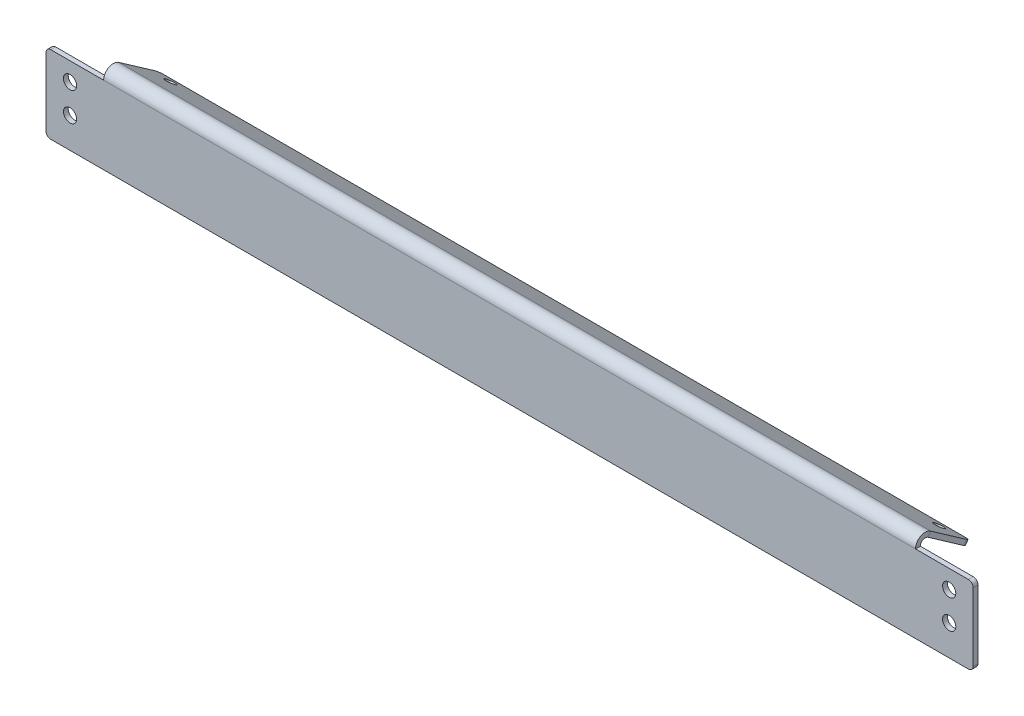
ISO-10303-21;
HEADER;
FILE_DESCRIPTION(('STEP AP214'),'2;1');
FILE_NAME('part.step','',(''),(''),'','','');
FILE_SCHEMA(('AUTOMOTIVE_DESIGN { 1 0 10303 214 1 1 1 1 }'));
ENDSEC;
DATA;
#1=APPLICATION_CONTEXT('core data for automotive mechanical design processes');
#2=APPLICATION_PROTOCOL_DEFINITION('international standard','automotive_design',2000,#1);
#3=PRODUCT_CONTEXT('',#1,'mechanical');
#4=PRODUCT('Part','Part','',(#3));
#5=PRODUCT_RELATED_PRODUCT_CATEGORY('part','',(#4));
#6=PRODUCT_DEFINITION_FORMATION('','',#4);
#7=PRODUCT_DEFINITION_CONTEXT('part definition',#1,'design');
#8=PRODUCT_DEFINITION('design','',#6,#7);
#9=PRODUCT_DEFINITION_SHAPE('','',#8);
#10=(LENGTH_UNIT() NAMED_UNIT(*) SI_UNIT(.MILLI.,.METRE.));
#11=(NAMED_UNIT(*) PLANE_ANGLE_UNIT() SI_UNIT($,.RADIAN.));
#12=(NAMED_UNIT(*) SI_UNIT($,.STERADIAN.) SOLID_ANGLE_UNIT());
#13=UNCERTAINTY_MEASURE_WITH_UNIT(LENGTH_MEASURE(1.E-05),#10,'distance_accuracy_value','');
#14=(GEOMETRIC_REPRESENTATION_CONTEXT(3) GLOBAL_UNCERTAINTY_ASSIGNED_CONTEXT((#13)) GLOBAL_UNIT_ASSIGNED_CONTEXT((#10,
#11,#12)) REPRESENTATION_CONTEXT('',''));
#15=CARTESIAN_POINT('',(0.,0.,0.));
#16=DIRECTION('',(0.,0.,1.));
#17=DIRECTION('',(1.,0.,0.));
#18=AXIS2_PLACEMENT_3D('',#15,#16,#17);
#19=CARTESIAN_POINT('',(612.775,60.8991922593825,1.82110518541458));
#20=DIRECTION('',(0.,0.819152044288989,-0.57357643635105));
#21=DIRECTION('',(0.,0.57357643635105,0.819152044288989));
#22=AXIS2_PLACEMENT_3D('',#19,#20,#21);
#23=PLANE('',#22);
#24=CARTESIAN_POINT('',(560.3875,39.9564826271147,-28.0881838316871));
#25=DIRECTION('',(0.,0.819152044288989,-0.57357643635105));
#26=DIRECTION('',(0.,0.57357643635105,0.819152044288989));
#27=AXIS2_PLACEMENT_3D('',#24,#25,#26);
#28=CIRCLE('',#27,3.429);
#29=CARTESIAN_POINT('',(560.3875,41.9232762273625,-25.2793114718202));
#30=VERTEX_POINT('',#29);
#31=EDGE_CURVE('E544',#30,#30,#28,.T.);
#32=ORIENTED_EDGE('',*,*,#31,.T.);
#33=EDGE_LOOP('',(#32));
#34=FACE_BOUND('',#33,.T.);
#35=CARTESIAN_POINT('',(52.3874999999999,39.9564826271147,-28.0881838316871));
#36=DIRECTION('',(0.,0.819152044288989,-0.57357643635105));
#37=DIRECTION('',(0.,0.57357643635105,0.819152044288989));
#38=AXIS2_PLACEMENT_3D('',#35,#36,#37);
#39=CIRCLE('',#38,3.429);
#40=CARTESIAN_POINT('',(52.3874999999999,41.9232762273625,-25.2793114718202));
#41=VERTEX_POINT('',#40);
#42=EDGE_CURVE('E567',#41,#41,#39,.T.);
#43=ORIENTED_EDGE('',*,*,#42,.T.);
#44=EDGE_LOOP('',(#43));
#45=FACE_BOUND('',#44,.T.);
#46=DIRECTION('',(-1.,0.,0.));
#47=VECTOR('',#46,1.);
#48=CARTESIAN_POINT('',(612.775,35.4037196635783,-34.590203183231));
#49=LINE('',#48,#47);
#50=CARTESIAN_POINT('',(571.5,35.4037196635783,-34.590203183231));
#51=VERTEX_POINT('',#50);
#52=CARTESIAN_POINT('',(41.2750000000001,35.4037196635783,-34.590203183231));
#53=VERTEX_POINT('',#52);
#54=EDGE_CURVE('E384',#51,#53,#49,.T.);
#55=ORIENTED_EDGE('',*,*,#54,.F.);
#56=CARTESIAN_POINT('',(571.5,37.2248248489929,-31.9893954426134));
#57=DIRECTION('',(0.,0.819152044288989,-0.57357643635105));
#58=DIRECTION('',(0.,0.57357643635105,0.819152044288989));
#59=AXIS2_PLACEMENT_3D('',#56,#57,#58);
#60=CIRCLE('',#59,3.175);
#61=CARTESIAN_POINT('',(574.675,37.2248248489929,-31.9893954426134));
#62=VERTEX_POINT('',#61);
#63=EDGE_CURVE('E315',#51,#62,#60,.F.);
#64=ORIENTED_EDGE('',*,*,#63,.T.);
#65=DIRECTION('',(0.,0.57357643635105,0.819152044288989));
#66=VECTOR('',#65,1.);
#67=CARTESIAN_POINT('',(574.675,60.8991922593825,1.82110518541458));
#68=LINE('',#67,#66);
#69=CARTESIAN_POINT('',(574.675,53.9025712343506,-8.17110518541458));
#70=VERTEX_POINT('',#69);
#71=EDGE_CURVE('E309',#62,#70,#68,.T.);
#72=ORIENTED_EDGE('',*,*,#71,.T.);
#73=DIRECTION('',(-1.,0.,0.));
#74=VECTOR('',#73,1.);
#75=CARTESIAN_POINT('',(612.775,53.9025712343506,-8.17110518541458));
#76=LINE('',#75,#74);
#77=CARTESIAN_POINT('',(38.1,53.9025712343506,-8.17110518541458));
#78=VERTEX_POINT('',#77);
#79=EDGE_CURVE('E314',#70,#78,#76,.T.);
#80=ORIENTED_EDGE('',*,*,#79,.T.);
#81=DIRECTION('',(0.,-0.57357643635105,-0.819152044288989));
#82=VECTOR('',#81,1.);
#83=CARTESIAN_POINT('',(38.1,44.6531454489644,-21.3806541843228));
#84=LINE('',#83,#82);
#85=CARTESIAN_POINT('',(38.1,37.2248248489929,-31.9893954426134));
#86=VERTEX_POINT('',#85);
#87=EDGE_CURVE('E525',#86,#78,#84,.F.);
#88=ORIENTED_EDGE('',*,*,#87,.F.);
#89=CARTESIAN_POINT('',(41.2750000000001,37.2248248489929,-31.9893954426134));
#90=DIRECTION('',(0.,0.819152044288989,-0.57357643635105));
#91=DIRECTION('',(0.,0.57357643635105,0.819152044288989));
#92=AXIS2_PLACEMENT_3D('',#89,#90,#91);
#93=CIRCLE('',#92,3.175);
#94=EDGE_CURVE('E396',#86,#53,#93,.F.);
#95=ORIENTED_EDGE('',*,*,#94,.T.);
#96=EDGE_LOOP('',(#55,#64,#72,#80,#88,#95));
#97=FACE_BOUND('',#96,.T.);
#98=ADVANCED_FACE('F196',(#34,#45,#97),#23,.F.);
#99=CARTESIAN_POINT('',(612.775,38.0045274041958,-36.4113083686456));
#100=DIRECTION('',(0.,-0.57357643635105,-0.819152044288989));
#101=DIRECTION('',(0.,0.819152044288989,-0.57357643635105));
#102=AXIS2_PLACEMENT_3D('',#99,#100,#101);
#103=PLANE('',#102);
#104=DIRECTION('',(-1.,0.,0.));
#105=VECTOR('',#104,1.);
#106=CARTESIAN_POINT('',(612.775,38.0045274041958,-36.4113083686456));
#107=LINE('',#106,#105);
#108=CARTESIAN_POINT('',(571.5,38.0045274041958,-36.4113083686456));
#109=VERTEX_POINT('',#108);
#110=CARTESIAN_POINT('',(41.2750000000001,38.0045274041958,-36.4113083686456));
#111=VERTEX_POINT('',#110);
#112=EDGE_CURVE('E380',#109,#111,#107,.T.);
#113=ORIENTED_EDGE('',*,*,#112,.F.);
#114=DIRECTION('',(0.,0.819152044288989,-0.57357643635105));
#115=VECTOR('',#114,1.);
#116=CARTESIAN_POINT('',(571.5,38.0045274041958,-36.4113083686456));
#117=LINE('',#116,#115);
#118=EDGE_CURVE('E392',#109,#51,#117,.F.);
#119=ORIENTED_EDGE('',*,*,#118,.T.);
#120=ORIENTED_EDGE('',*,*,#54,.T.);
#121=DIRECTION('',(0.,-0.819152044288989,0.57357643635105));
#122=VECTOR('',#121,1.);
#123=CARTESIAN_POINT('',(41.2750000000001,38.0045274041958,-36.4113083686455));
#124=LINE('',#123,#122);
#125=EDGE_CURVE('E388',#53,#111,#124,.F.);
#126=ORIENTED_EDGE('',*,*,#125,.T.);
#127=EDGE_LOOP('',(#113,#119,#120,#126));
#128=FACE_BOUND('',#127,.T.);
#129=ADVANCED_FACE('F594',(#128),#103,.T.);
#130=CARTESIAN_POINT('',(612.775,63.5,0.));
#131=DIRECTION('',(0.,0.819152044288989,-0.57357643635105));
#132=DIRECTION('',(0.,0.57357643635105,0.819152044288989));
#133=AXIS2_PLACEMENT_3D('',#130,#131,#132);
#134=PLANE('',#133);
#135=CARTESIAN_POINT('',(560.3875,42.5572903677323,-29.9092890171017));
#136=DIRECTION('',(0.,0.819152044288989,-0.57357643635105));
#137=DIRECTION('',(0.,0.57357643635105,0.819152044288989));
#138=AXIS2_PLACEMENT_3D('',#135,#136,#137);
#139=CIRCLE('',#138,3.429);
#140=CARTESIAN_POINT('',(560.3875,44.52408396798,-27.1004166572348));
#141=VERTEX_POINT('',#140);
#142=EDGE_CURVE('E571',#141,#141,#139,.T.);
#143=ORIENTED_EDGE('',*,*,#142,.F.);
#144=EDGE_LOOP('',(#143));
#145=FACE_BOUND('',#144,.T.);
#146=CARTESIAN_POINT('',(52.3874999999999,42.5572903677323,-29.9092890171017));
#147=DIRECTION('',(0.,0.819152044288989,-0.57357643635105));
#148=DIRECTION('',(0.,0.57357643635105,0.819152044288989));
#149=AXIS2_PLACEMENT_3D('',#146,#147,#148);
#150=CIRCLE('',#149,3.429);
#151=CARTESIAN_POINT('',(52.3874999999999,44.52408396798,-27.1004166572348));
#152=VERTEX_POINT('',#151);
#153=EDGE_CURVE('E563',#152,#152,#150,.T.);
#154=ORIENTED_EDGE('',*,*,#153,.F.);
#155=EDGE_LOOP('',(#154));
#156=FACE_BOUND('',#155,.T.);
#157=DIRECTION('',(0.,0.57357643635105,0.819152044288989));
#158=VECTOR('',#157,1.);
#159=CARTESIAN_POINT('',(574.675,47.253953189582,-23.2017593697374));
#160=LINE('',#159,#158);
#161=CARTESIAN_POINT('',(574.675,39.8256325896104,-33.810500628028));
#162=VERTEX_POINT('',#161);
#163=CARTESIAN_POINT('',(574.675,56.5033789749681,-9.99221037082916));
#164=VERTEX_POINT('',#163);
#165=EDGE_CURVE('E320',#162,#164,#160,.T.);
#166=ORIENTED_EDGE('',*,*,#165,.F.);
#167=CARTESIAN_POINT('',(571.5,39.8256325896104,-33.810500628028));
#168=DIRECTION('',(0.,0.819152044288989,-0.57357643635105));
#169=DIRECTION('',(0.,0.57357643635105,0.819152044288989));
#170=AXIS2_PLACEMENT_3D('',#167,#168,#169);
#171=CIRCLE('',#170,3.175);
#172=EDGE_CURVE('E407',#162,#109,#171,.T.);
#173=ORIENTED_EDGE('',*,*,#172,.T.);
#174=ORIENTED_EDGE('',*,*,#112,.T.);
#175=CARTESIAN_POINT('',(41.2750000000001,39.8256325896104,-33.810500628028));
#176=DIRECTION('',(0.,0.819152044288989,-0.57357643635105));
#177=DIRECTION('',(0.,0.57357643635105,0.819152044288989));
#178=AXIS2_PLACEMENT_3D('',#175,#176,#177);
#179=CIRCLE('',#178,3.175);
#180=CARTESIAN_POINT('',(38.1,39.8256325896104,-33.810500628028));
#181=VERTEX_POINT('',#180);
#182=EDGE_CURVE('E404',#111,#181,#179,.T.);
#183=ORIENTED_EDGE('',*,*,#182,.T.);
#184=DIRECTION('',(0.,0.57357643635105,0.819152044288989));
#185=VECTOR('',#184,1.);
#186=CARTESIAN_POINT('',(38.1,63.5,0.));
#187=LINE('',#186,#185);
#188=CARTESIAN_POINT('',(38.1,56.5033789749681,-9.99221037082916));
#189=VERTEX_POINT('',#188);
#190=EDGE_CURVE('E522',#181,#189,#187,.T.);
#191=ORIENTED_EDGE('',*,*,#190,.T.);
#192=DIRECTION('',(-1.,0.,0.));
#193=VECTOR('',#192,1.);
#194=CARTESIAN_POINT('',(612.775,56.5033789749681,-9.99221037082916));
#195=LINE('',#194,#193);
#196=EDGE_CURVE('E376',#164,#189,#195,.T.);
#197=ORIENTED_EDGE('',*,*,#196,.F.);
#198=EDGE_LOOP('',(#166,#173,#174,#183,#191,#197));
#199=FACE_BOUND('',#198,.T.);
#200=ADVANCED_FACE('F590',(#145,#156,#199),#134,.T.);
#201=CARTESIAN_POINT('',(612.775,51.301763493733,-6.35));
#202=DIRECTION('',(-1.,0.,0.));
#203=DIRECTION('',(0.,0.,1.));
#204=AXIS2_PLACEMENT_3D('',#201,#202,#203);
#205=CYLINDRICAL_SURFACE('',#204,6.35);
#206=ORIENTED_EDGE('',*,*,#196,.T.);
#207=CARTESIAN_POINT('',(38.1,51.301763493733,-6.35));
#208=DIRECTION('',(1.,0.,0.));
#209=DIRECTION('',(0.,0.,-1.));
#210=AXIS2_PLACEMENT_3D('',#207,#208,#209);
#211=CIRCLE('',#210,6.35);
#212=CARTESIAN_POINT('',(38.1,51.301763493733,0.));
#213=VERTEX_POINT('',#212);
#214=EDGE_CURVE('E501',#189,#213,#211,.T.);
#215=ORIENTED_EDGE('',*,*,#214,.T.);
#216=DIRECTION('',(-1.,0.,0.));
#217=VECTOR('',#216,1.);
#218=CARTESIAN_POINT('',(612.775,51.301763493733,0.));
#219=LINE('',#218,#217);
#220=CARTESIAN_POINT('',(574.675,51.301763493733,0.));
#221=VERTEX_POINT('',#220);
#222=EDGE_CURVE('E372',#221,#213,#219,.T.);
#223=ORIENTED_EDGE('',*,*,#222,.F.);
#224=CARTESIAN_POINT('',(574.675,51.301763493733,-6.35));
#225=DIRECTION('',(-1.,0.,0.));
#226=DIRECTION('',(0.,0.,1.));
#227=AXIS2_PLACEMENT_3D('',#224,#225,#226);
#228=CIRCLE('',#227,6.35);
#229=EDGE_CURVE('E341',#221,#164,#228,.T.);
#230=ORIENTED_EDGE('',*,*,#229,.T.);
#231=EDGE_LOOP('',(#206,#215,#223,#230));
#232=FACE_BOUND('',#231,.T.);
#233=ADVANCED_FACE('F593',(#232),#205,.T.);
#234=CARTESIAN_POINT('',(612.775,51.301763493733,-6.35));
#235=DIRECTION('',(-1.,0.,0.));
#236=DIRECTION('',(0.,0.,1.));
#237=AXIS2_PLACEMENT_3D('',#234,#235,#236);
#238=CYLINDRICAL_SURFACE('',#237,3.175);
#239=CARTESIAN_POINT('',(38.1,51.301763493733,-6.35));
#240=DIRECTION('',(1.,0.,0.));
#241=DIRECTION('',(0.,0.,-1.));
#242=AXIS2_PLACEMENT_3D('',#239,#240,#241);
#243=CIRCLE('',#242,3.175);
#244=CARTESIAN_POINT('',(38.1,51.301763493733,-3.175));
#245=VERTEX_POINT('',#244);
#246=EDGE_CURVE('E346',#78,#245,#243,.T.);
#247=ORIENTED_EDGE('',*,*,#246,.F.);
#248=ORIENTED_EDGE('',*,*,#79,.F.);
#249=CARTESIAN_POINT('',(574.675,51.301763493733,-6.35));
#250=DIRECTION('',(1.,0.,0.));
#251=DIRECTION('',(0.,0.,-1.));
#252=AXIS2_PLACEMENT_3D('',#249,#250,#251);
#253=CIRCLE('',#252,3.175);
#254=CARTESIAN_POINT('',(574.675,51.301763493733,-3.175));
#255=VERTEX_POINT('',#254);
#256=EDGE_CURVE('E331',#255,#70,#253,.F.);
#257=ORIENTED_EDGE('',*,*,#256,.F.);
#258=DIRECTION('',(-1.,0.,0.));
#259=VECTOR('',#258,1.);
#260=CARTESIAN_POINT('',(612.775,51.301763493733,-3.175));
#261=LINE('',#260,#259);
#262=EDGE_CURVE('E348',#255,#245,#261,.T.);
#263=ORIENTED_EDGE('',*,*,#262,.T.);
#264=EDGE_LOOP('',(#247,#248,#257,#263));
#265=FACE_BOUND('',#264,.T.);
#266=ADVANCED_FACE('F344',(#265),#238,.F.);
#267=CARTESIAN_POINT('',(0.,53.9025712343506,-8.17110518541458));
#268=DIRECTION('',(-1.,0.,0.));
#269=DIRECTION('',(0.,0.,1.));
#270=AXIS2_PLACEMENT_3D('',#267,#268,#269);
#271=PLANE('',#270);
#272=DIRECTION('',(0.,1.,0.));
#273=VECTOR('',#272,1.);
#274=CARTESIAN_POINT('',(0.,0.,0.));
#275=LINE('',#274,#273);
#276=CARTESIAN_POINT('',(0.,3.175,0.));
#277=VERTEX_POINT('',#276);
#278=CARTESIAN_POINT('',(0.,48.1267634937331,0.));
#279=VERTEX_POINT('',#278);
#280=EDGE_CURVE('E481',#277,#279,#275,.T.);
#281=ORIENTED_EDGE('',*,*,#280,.T.);
#282=DIRECTION('',(0.,0.,-1.));
#283=VECTOR('',#282,1.);
#284=CARTESIAN_POINT('',(0.,48.1267634937331,-8.17110518541458));
#285=LINE('',#284,#283);
#286=CARTESIAN_POINT('',(0.,48.1267634937331,-3.175));
#287=VERTEX_POINT('',#286);
#288=EDGE_CURVE('E417',#279,#287,#285,.T.);
#289=ORIENTED_EDGE('',*,*,#288,.T.);
#290=DIRECTION('',(0.,1.,0.));
#291=VECTOR('',#290,1.);
#292=CARTESIAN_POINT('',(0.,0.,-3.175));
#293=LINE('',#292,#291);
#294=CARTESIAN_POINT('',(0.,3.175,-3.175));
#295=VERTEX_POINT('',#294);
#296=EDGE_CURVE('E360',#295,#287,#293,.T.);
#297=ORIENTED_EDGE('',*,*,#296,.F.);
#298=DIRECTION('',(0.,0.,1.));
#299=VECTOR('',#298,1.);
#300=CARTESIAN_POINT('',(0.,3.175,-8.17110518541458));
#301=LINE('',#300,#299);
#302=EDGE_CURVE('E413',#295,#277,#301,.T.);
#303=ORIENTED_EDGE('',*,*,#302,.T.);
#304=EDGE_LOOP('',(#281,#289,#297,#303));
#305=FACE_BOUND('',#304,.T.);
#306=ADVANCED_FACE('F488',(#305),#271,.T.);
#307=CARTESIAN_POINT('',(612.775,0.,0.));
#308=DIRECTION('',(0.,0.,1.));
#309=DIRECTION('',(1.,0.,0.));
#310=AXIS2_PLACEMENT_3D('',#307,#308,#309);
#311=PLANE('',#310);
#312=CARTESIAN_POINT('',(596.9,39.109763493733,0.));
#313=DIRECTION('',(0.,0.,1.));
#314=DIRECTION('',(1.,0.,0.));
#315=AXIS2_PLACEMENT_3D('',#312,#313,#314);
#316=CIRCLE('',#315,4.36879999999994);
#317=CARTESIAN_POINT('',(601.2688,39.109763493733,0.));
#318=VERTEX_POINT('',#317);
#319=EDGE_CURVE('E539',#318,#318,#316,.T.);
#320=ORIENTED_EDGE('',*,*,#319,.F.);
#321=EDGE_LOOP('',(#320));
#322=FACE_BOUND('',#321,.T.);
#323=CARTESIAN_POINT('',(596.9,20.059763493733,0.));
#324=DIRECTION('',(0.,0.,1.));
#325=DIRECTION('',(1.,0.,0.));
#326=AXIS2_PLACEMENT_3D('',#323,#324,#325);
#327=CIRCLE('',#326,4.36879999999994);
#328=CARTESIAN_POINT('',(601.2688,20.059763493733,0.));
#329=VERTEX_POINT('',#328);
#330=EDGE_CURVE('E548',#329,#329,#327,.T.);
#331=ORIENTED_EDGE('',*,*,#330,.F.);
#332=EDGE_LOOP('',(#331));
#333=FACE_BOUND('',#332,.T.);
#334=CARTESIAN_POINT('',(15.875,20.059763493733,0.));
#335=DIRECTION('',(0.,0.,1.));
#336=DIRECTION('',(1.,0.,0.));
#337=AXIS2_PLACEMENT_3D('',#334,#335,#336);
#338=CIRCLE('',#337,4.3688);
#339=CARTESIAN_POINT('',(20.2438,20.059763493733,0.));
#340=VERTEX_POINT('',#339);
#341=EDGE_CURVE('E556',#340,#340,#338,.T.);
#342=ORIENTED_EDGE('',*,*,#341,.F.);
#343=EDGE_LOOP('',(#342));
#344=FACE_BOUND('',#343,.T.);
#345=CARTESIAN_POINT('',(15.875,39.109763493733,0.));
#346=DIRECTION('',(0.,0.,1.));
#347=DIRECTION('',(1.,0.,0.));
#348=AXIS2_PLACEMENT_3D('',#345,#346,#347);
#349=CIRCLE('',#348,4.3688);
#350=CARTESIAN_POINT('',(20.2438,39.109763493733,0.));
#351=VERTEX_POINT('',#350);
#352=EDGE_CURVE('E531',#351,#351,#349,.T.);
#353=ORIENTED_EDGE('',*,*,#352,.F.);
#354=EDGE_LOOP('',(#353));
#355=FACE_BOUND('',#354,.T.);
#356=DIRECTION('',(-1.,0.,0.));
#357=VECTOR('',#356,1.);
#358=CARTESIAN_POINT('',(612.775,51.3017634937331,0.));
#359=LINE('',#358,#357);
#360=CARTESIAN_POINT('',(3.17500000000004,51.3017634937331,0.));
#361=VERTEX_POINT('',#360);
#362=EDGE_CURVE('E511',#213,#361,#359,.T.);
#363=ORIENTED_EDGE('',*,*,#362,.T.);
#364=CARTESIAN_POINT('',(3.175,48.1267634937331,0.));
#365=DIRECTION('',(0.,0.,1.));
#366=DIRECTION('',(1.,0.,0.));
#367=AXIS2_PLACEMENT_3D('',#364,#365,#366);
#368=CIRCLE('',#367,3.175);
#369=EDGE_CURVE('E444',#361,#279,#368,.T.);
#370=ORIENTED_EDGE('',*,*,#369,.T.);
#371=ORIENTED_EDGE('',*,*,#280,.F.);
#372=CARTESIAN_POINT('',(3.175,3.175,0.));
#373=DIRECTION('',(0.,0.,1.));
#374=DIRECTION('',(1.,0.,0.));
#375=AXIS2_PLACEMENT_3D('',#372,#373,#374);
#376=CIRCLE('',#375,3.175);
#377=CARTESIAN_POINT('',(3.17500000000004,0.,0.));
#378=VERTEX_POINT('',#377);
#379=EDGE_CURVE('E441',#277,#378,#376,.T.);
#380=ORIENTED_EDGE('',*,*,#379,.T.);
#381=DIRECTION('',(-1.,0.,0.));
#382=VECTOR('',#381,1.);
#383=CARTESIAN_POINT('',(612.775,0.,0.));
#384=LINE('',#383,#382);
#385=CARTESIAN_POINT('',(609.6,0.,0.));
#386=VERTEX_POINT('',#385);
#387=EDGE_CURVE('E368',#386,#378,#384,.T.);
#388=ORIENTED_EDGE('',*,*,#387,.F.);
#389=CARTESIAN_POINT('',(609.6,3.175,0.));
#390=DIRECTION('',(0.,0.,1.));
#391=DIRECTION('',(1.,0.,0.));
#392=AXIS2_PLACEMENT_3D('',#389,#390,#391);
#393=CIRCLE('',#392,3.175);
#394=CARTESIAN_POINT('',(612.775,3.175,0.));
#395=VERTEX_POINT('',#394);
#396=EDGE_CURVE('E438',#386,#395,#393,.T.);
#397=ORIENTED_EDGE('',*,*,#396,.T.);
#398=DIRECTION('',(0.,1.,0.));
#399=VECTOR('',#398,1.);
#400=CARTESIAN_POINT('',(612.775,0.,0.));
#401=LINE('',#400,#399);
#402=CARTESIAN_POINT('',(612.775,48.126763493733,0.));
#403=VERTEX_POINT('',#402);
#404=EDGE_CURVE('E357',#395,#403,#401,.T.);
#405=ORIENTED_EDGE('',*,*,#404,.T.);
#406=CARTESIAN_POINT('',(609.6,48.126763493733,0.));
#407=DIRECTION('',(0.,0.,1.));
#408=DIRECTION('',(1.,0.,0.));
#409=AXIS2_PLACEMENT_3D('',#406,#407,#408);
#410=CIRCLE('',#409,3.175);
#411=CARTESIAN_POINT('',(609.6,51.301763493733,0.));
#412=VERTEX_POINT('',#411);
#413=EDGE_CURVE('E212',#403,#412,#410,.T.);
#414=ORIENTED_EDGE('',*,*,#413,.T.);
#415=EDGE_CURVE('E373',#412,#221,#219,.T.);
#416=ORIENTED_EDGE('',*,*,#415,.T.);
#417=ORIENTED_EDGE('',*,*,#222,.T.);
#418=EDGE_LOOP('',(#363,#370,#371,#380,#388,#397,#405,#414,#416,#417));
#419=FACE_BOUND('',#418,.T.);
#420=ADVANCED_FACE('F478',(#322,#333,#344,#355,#419),#311,.T.);
#421=CARTESIAN_POINT('',(612.775,0.,-3.175));
#422=DIRECTION('',(0.,-1.,0.));
#423=DIRECTION('',(0.,0.,-1.));
#424=AXIS2_PLACEMENT_3D('',#421,#422,#423);
#425=PLANE('',#424);
#426=ORIENTED_EDGE('',*,*,#387,.T.);
#427=DIRECTION('',(0.,0.,1.));
#428=VECTOR('',#427,1.);
#429=CARTESIAN_POINT('',(3.17500000000004,0.,-3.175));
#430=LINE('',#429,#428);
#431=CARTESIAN_POINT('',(3.17500000000004,0.,-3.175));
#432=VERTEX_POINT('',#431);
#433=EDGE_CURVE('E451',#378,#432,#430,.F.);
#434=ORIENTED_EDGE('',*,*,#433,.T.);
#435=DIRECTION('',(-1.,0.,0.));
#436=VECTOR('',#435,1.);
#437=CARTESIAN_POINT('',(612.775,0.,-3.175));
#438=LINE('',#437,#436);
#439=CARTESIAN_POINT('',(609.6,0.,-3.175));
#440=VERTEX_POINT('',#439);
#441=EDGE_CURVE('E364',#440,#432,#438,.T.);
#442=ORIENTED_EDGE('',*,*,#441,.F.);
#443=DIRECTION('',(0.,0.,1.));
#444=VECTOR('',#443,1.);
#445=CARTESIAN_POINT('',(609.6,0.,-3.175));
#446=LINE('',#445,#444);
#447=EDGE_CURVE('E447',#440,#386,#446,.T.);
#448=ORIENTED_EDGE('',*,*,#447,.T.);
#449=EDGE_LOOP('',(#426,#434,#442,#448));
#450=FACE_BOUND('',#449,.T.);
#451=ADVANCED_FACE('F475',(#450),#425,.T.);
#452=CARTESIAN_POINT('',(612.775,0.,-3.175));
#453=DIRECTION('',(0.,0.,1.));
#454=DIRECTION('',(1.,0.,0.));
#455=AXIS2_PLACEMENT_3D('',#452,#453,#454);
#456=PLANE('',#455);
#457=CARTESIAN_POINT('',(596.9,39.109763493733,-3.175));
#458=DIRECTION('',(0.,0.,1.));
#459=DIRECTION('',(1.,0.,0.));
#460=AXIS2_PLACEMENT_3D('',#457,#458,#459);
#461=CIRCLE('',#460,4.36879999999994);
#462=CARTESIAN_POINT('',(601.2688,39.109763493733,-3.175));
#463=VERTEX_POINT('',#462);
#464=EDGE_CURVE('E543',#463,#463,#461,.T.);
#465=ORIENTED_EDGE('',*,*,#464,.T.);
#466=EDGE_LOOP('',(#465));
#467=FACE_BOUND('',#466,.T.);
#468=CARTESIAN_POINT('',(596.9,20.059763493733,-3.175));
#469=DIRECTION('',(0.,0.,1.));
#470=DIRECTION('',(1.,0.,0.));
#471=AXIS2_PLACEMENT_3D('',#468,#469,#470);
#472=CIRCLE('',#471,4.36879999999994);
#473=CARTESIAN_POINT('',(601.2688,20.059763493733,-3.175));
#474=VERTEX_POINT('',#473);
#475=EDGE_CURVE('E552',#474,#474,#472,.T.);
#476=ORIENTED_EDGE('',*,*,#475,.T.);
#477=EDGE_LOOP('',(#476));
#478=FACE_BOUND('',#477,.T.);
#479=CARTESIAN_POINT('',(15.875,20.059763493733,-3.175));
#480=DIRECTION('',(0.,0.,1.));
#481=DIRECTION('',(1.,0.,0.));
#482=AXIS2_PLACEMENT_3D('',#479,#480,#481);
#483=CIRCLE('',#482,4.3688);
#484=CARTESIAN_POINT('',(20.2438,20.059763493733,-3.175));
#485=VERTEX_POINT('',#484);
#486=EDGE_CURVE('E535',#485,#485,#483,.T.);
#487=ORIENTED_EDGE('',*,*,#486,.T.);
#488=EDGE_LOOP('',(#487));
#489=FACE_BOUND('',#488,.T.);
#490=CARTESIAN_POINT('',(15.875,39.109763493733,-3.175));
#491=DIRECTION('',(0.,0.,1.));
#492=DIRECTION('',(1.,0.,0.));
#493=AXIS2_PLACEMENT_3D('',#490,#491,#492);
#494=CIRCLE('',#493,4.3688);
#495=CARTESIAN_POINT('',(20.2438,39.109763493733,-3.175));
#496=VERTEX_POINT('',#495);
#497=EDGE_CURVE('E528',#496,#496,#494,.T.);
#498=ORIENTED_EDGE('',*,*,#497,.T.);
#499=EDGE_LOOP('',(#498));
#500=FACE_BOUND('',#499,.T.);
#501=ORIENTED_EDGE('',*,*,#296,.T.);
#502=CARTESIAN_POINT('',(3.175,48.1267634937331,-3.175));
#503=DIRECTION('',(0.,0.,1.));
#504=DIRECTION('',(1.,0.,0.));
#505=AXIS2_PLACEMENT_3D('',#502,#503,#504);
#506=CIRCLE('',#505,3.175);
#507=CARTESIAN_POINT('',(3.17500000000004,51.3017634937331,-3.17499999999999));
#508=VERTEX_POINT('',#507);
#509=EDGE_CURVE('E430',#287,#508,#506,.F.);
#510=ORIENTED_EDGE('',*,*,#509,.T.);
#511=DIRECTION('',(-1.,0.,0.));
#512=VECTOR('',#511,1.);
#513=CARTESIAN_POINT('',(612.775,51.3017634937331,-3.17499999999999));
#514=LINE('',#513,#512);
#515=EDGE_CURVE('E514',#245,#508,#514,.T.);
#516=ORIENTED_EDGE('',*,*,#515,.F.);
#517=ORIENTED_EDGE('',*,*,#262,.F.);
#518=CARTESIAN_POINT('',(609.6,51.301763493733,-3.175));
#519=VERTEX_POINT('',#518);
#520=EDGE_CURVE('E354',#519,#255,#261,.T.);
#521=ORIENTED_EDGE('',*,*,#520,.F.);
#522=CARTESIAN_POINT('',(609.6,48.126763493733,-3.175));
#523=DIRECTION('',(0.,0.,1.));
#524=DIRECTION('',(1.,0.,0.));
#525=AXIS2_PLACEMENT_3D('',#522,#523,#524);
#526=CIRCLE('',#525,3.175);
#527=CARTESIAN_POINT('',(612.775,48.126763493733,-3.175));
#528=VERTEX_POINT('',#527);
#529=EDGE_CURVE('E421',#519,#528,#526,.F.);
#530=ORIENTED_EDGE('',*,*,#529,.T.);
#531=DIRECTION('',(0.,1.,0.));
#532=VECTOR('',#531,1.);
#533=CARTESIAN_POINT('',(612.775,0.,-3.175));
#534=LINE('',#533,#532);
#535=CARTESIAN_POINT('',(612.775,3.175,-3.175));
#536=VERTEX_POINT('',#535);
#537=EDGE_CURVE('E349',#536,#528,#534,.T.);
#538=ORIENTED_EDGE('',*,*,#537,.F.);
#539=CARTESIAN_POINT('',(609.6,3.175,-3.175));
#540=DIRECTION('',(0.,0.,1.));
#541=DIRECTION('',(1.,0.,0.));
#542=AXIS2_PLACEMENT_3D('',#539,#540,#541);
#543=CIRCLE('',#542,3.175);
#544=EDGE_CURVE('E424',#536,#440,#543,.F.);
#545=ORIENTED_EDGE('',*,*,#544,.T.);
#546=ORIENTED_EDGE('',*,*,#441,.T.);
#547=CARTESIAN_POINT('',(3.175,3.175,-3.175));
#548=DIRECTION('',(0.,0.,1.));
#549=DIRECTION('',(1.,0.,0.));
#550=AXIS2_PLACEMENT_3D('',#547,#548,#549);
#551=CIRCLE('',#550,3.175);
#552=EDGE_CURVE('E427',#432,#295,#551,.F.);
#553=ORIENTED_EDGE('',*,*,#552,.T.);
#554=EDGE_LOOP('',(#501,#510,#516,#517,#521,#530,#538,#545,#546,#553));
#555=FACE_BOUND('',#554,.T.);
#556=ADVANCED_FACE('F467',(#467,#478,#489,#500,#555),#456,.F.);
#557=CARTESIAN_POINT('',(612.775,51.301763493733,-6.35));
#558=DIRECTION('',(1.,0.,0.));
#559=DIRECTION('',(0.,0.,-1.));
#560=AXIS2_PLACEMENT_3D('',#557,#558,#559);
#561=PLANE('',#560);
#562=ORIENTED_EDGE('',*,*,#404,.F.);
#563=DIRECTION('',(0.,0.,1.));
#564=VECTOR('',#563,1.);
#565=CARTESIAN_POINT('',(612.775,3.175,-6.35));
#566=LINE('',#565,#564);
#567=EDGE_CURVE('E205',#395,#536,#566,.F.);
#568=ORIENTED_EDGE('',*,*,#567,.T.);
#569=ORIENTED_EDGE('',*,*,#537,.T.);
#570=DIRECTION('',(0.,0.,1.));
#571=VECTOR('',#570,1.);
#572=CARTESIAN_POINT('',(612.775,48.126763493733,-6.35));
#573=LINE('',#572,#571);
#574=EDGE_CURVE('E454',#528,#403,#573,.T.);
#575=ORIENTED_EDGE('',*,*,#574,.T.);
#576=EDGE_LOOP('',(#562,#568,#569,#575));
#577=FACE_BOUND('',#576,.T.);
#578=ADVANCED_FACE('F462',(#577),#561,.T.);
#579=CARTESIAN_POINT('',(574.675,51.301763493733,-6.35));
#580=DIRECTION('',(1.,0.,0.));
#581=DIRECTION('',(0.,0.,-1.));
#582=AXIS2_PLACEMENT_3D('',#579,#580,#581);
#583=PLANE('',#582);
#584=DIRECTION('',(0.,0.,1.));
#585=VECTOR('',#584,1.);
#586=CARTESIAN_POINT('',(574.675,51.301763493733,-3.175));
#587=LINE('',#586,#585);
#588=EDGE_CURVE('E319',#255,#221,#587,.T.);
#589=ORIENTED_EDGE('',*,*,#588,.F.);
#590=ORIENTED_EDGE('',*,*,#256,.T.);
#591=DIRECTION('',(0.,-0.819152044288989,0.57357643635105));
#592=VECTOR('',#591,1.);
#593=CARTESIAN_POINT('',(574.675,56.5033789749681,-9.99221037082917));
#594=LINE('',#593,#592);
#595=EDGE_CURVE('E323',#164,#70,#594,.T.);
#596=ORIENTED_EDGE('',*,*,#595,.F.);
#597=ORIENTED_EDGE('',*,*,#229,.F.);
#598=EDGE_LOOP('',(#589,#590,#596,#597));
#599=FACE_BOUND('',#598,.T.);
#600=ADVANCED_FACE('F335',(#599),#583,.T.);
#601=CARTESIAN_POINT('',(593.725,51.301763493733,-3.175));
#602=DIRECTION('',(0.,1.,0.));
#603=DIRECTION('',(-1.,0.,0.));
#604=AXIS2_PLACEMENT_3D('',#601,#602,#603);
#605=PLANE('',#604);
#606=ORIENTED_EDGE('',*,*,#415,.F.);
#607=DIRECTION('',(0.,0.,1.));
#608=VECTOR('',#607,1.);
#609=CARTESIAN_POINT('',(609.6,51.301763493733,-3.175));
#610=LINE('',#609,#608);
#611=EDGE_CURVE('E12',#412,#519,#610,.F.);
#612=ORIENTED_EDGE('',*,*,#611,.T.);
#613=ORIENTED_EDGE('',*,*,#520,.T.);
#614=ORIENTED_EDGE('',*,*,#588,.T.);
#615=EDGE_LOOP('',(#606,#612,#613,#614));
#616=FACE_BOUND('',#615,.T.);
#617=ADVANCED_FACE('F619',(#616),#605,.T.);
#618=CARTESIAN_POINT('',(574.675,60.8991922593825,1.82110518541458));
#619=DIRECTION('',(-1.,0.,0.));
#620=DIRECTION('',(0.,0.57357643635105,0.819152044288989));
#621=AXIS2_PLACEMENT_3D('',#618,#619,#620);
#622=PLANE('',#621);
#623=ORIENTED_EDGE('',*,*,#71,.F.);
#624=DIRECTION('',(0.,-0.819152044288989,0.57357643635105));
#625=VECTOR('',#624,1.);
#626=CARTESIAN_POINT('',(574.675,37.2248248489929,-31.9893954426134));
#627=LINE('',#626,#625);
#628=EDGE_CURVE('E401',#62,#162,#627,.F.);
#629=ORIENTED_EDGE('',*,*,#628,.T.);
#630=ORIENTED_EDGE('',*,*,#165,.T.);
#631=ORIENTED_EDGE('',*,*,#595,.T.);
#632=EDGE_LOOP('',(#623,#629,#630,#631));
#633=FACE_BOUND('',#632,.T.);
#634=ADVANCED_FACE('F325',(#633),#622,.F.);
#635=CARTESIAN_POINT('',(38.1,51.301763493733,-6.35));
#636=DIRECTION('',(-1.,0.,0.));
#637=DIRECTION('',(0.,0.,1.));
#638=AXIS2_PLACEMENT_3D('',#635,#636,#637);
#639=PLANE('',#638);
#640=DIRECTION('',(0.,-0.819152044288989,0.57357643635105));
#641=VECTOR('',#640,1.);
#642=CARTESIAN_POINT('',(38.1,56.5033789749681,-9.99221037082917));
#643=LINE('',#642,#641);
#644=EDGE_CURVE('E507',#189,#78,#643,.T.);
#645=ORIENTED_EDGE('',*,*,#644,.T.);
#646=ORIENTED_EDGE('',*,*,#246,.T.);
#647=DIRECTION('',(0.,0.,1.));
#648=VECTOR('',#647,1.);
#649=CARTESIAN_POINT('',(38.1,51.3017634937331,-3.17499999999999));
#650=LINE('',#649,#648);
#651=EDGE_CURVE('E518',#245,#213,#650,.T.);
#652=ORIENTED_EDGE('',*,*,#651,.T.);
#653=ORIENTED_EDGE('',*,*,#214,.F.);
#654=EDGE_LOOP('',(#645,#646,#652,#653));
#655=FACE_BOUND('',#654,.T.);
#656=ADVANCED_FACE('F771',(#655),#639,.T.);
#657=CARTESIAN_POINT('',(19.05,51.3017634937331,-3.17499999999999));
#658=DIRECTION('',(0.,1.,0.));
#659=DIRECTION('',(-1.,0.,0.));
#660=AXIS2_PLACEMENT_3D('',#657,#658,#659);
#661=PLANE('',#660);
#662=ORIENTED_EDGE('',*,*,#515,.T.);
#663=DIRECTION('',(0.,0.,-1.));
#664=VECTOR('',#663,1.);
#665=CARTESIAN_POINT('',(3.175,51.3017634937331,-3.17499999999999));
#666=LINE('',#665,#664);
#667=EDGE_CURVE('E433',#508,#361,#666,.F.);
#668=ORIENTED_EDGE('',*,*,#667,.T.);
#669=ORIENTED_EDGE('',*,*,#362,.F.);
#670=ORIENTED_EDGE('',*,*,#651,.F.);
#671=EDGE_LOOP('',(#662,#668,#669,#670));
#672=FACE_BOUND('',#671,.T.);
#673=ADVANCED_FACE('F760',(#672),#661,.T.);
#674=CARTESIAN_POINT('',(38.1,63.5,0.));
#675=DIRECTION('',(1.,0.,0.));
#676=DIRECTION('',(0.,0.57357643635105,0.819152044288989));
#677=AXIS2_PLACEMENT_3D('',#674,#675,#676);
#678=PLANE('',#677);
#679=ORIENTED_EDGE('',*,*,#190,.F.);
#680=DIRECTION('',(0.,0.819152044288989,-0.57357643635105));
#681=VECTOR('',#680,1.);
#682=CARTESIAN_POINT('',(38.1,39.8256325896104,-33.810500628028));
#683=LINE('',#682,#681);
#684=EDGE_CURVE('E410',#181,#86,#683,.F.);
#685=ORIENTED_EDGE('',*,*,#684,.T.);
#686=ORIENTED_EDGE('',*,*,#87,.T.);
#687=ORIENTED_EDGE('',*,*,#644,.F.);
#688=EDGE_LOOP('',(#679,#685,#686,#687));
#689=FACE_BOUND('',#688,.T.);
#690=ADVANCED_FACE('F613',(#689),#678,.F.);
#691=CARTESIAN_POINT('',(15.875,39.109763493733,-3.175));
#692=DIRECTION('',(0.,0.,1.));
#693=DIRECTION('',(1.,0.,0.));
#694=AXIS2_PLACEMENT_3D('',#691,#692,#693);
#695=CYLINDRICAL_SURFACE('',#694,4.3688);
#696=ORIENTED_EDGE('',*,*,#497,.F.);
#697=EDGE_LOOP('',(#696));
#698=FACE_BOUND('',#697,.T.);
#699=ORIENTED_EDGE('',*,*,#352,.T.);
#700=EDGE_LOOP('',(#699));
#701=FACE_BOUND('',#700,.T.);
#702=ADVANCED_FACE('F737',(#698,#701),#695,.F.);
#703=CARTESIAN_POINT('',(15.875,20.059763493733,-3.175));
#704=DIRECTION('',(0.,0.,1.));
#705=DIRECTION('',(1.,0.,0.));
#706=AXIS2_PLACEMENT_3D('',#703,#704,#705);
#707=CYLINDRICAL_SURFACE('',#706,4.3688);
#708=ORIENTED_EDGE('',*,*,#486,.F.);
#709=EDGE_LOOP('',(#708));
#710=FACE_BOUND('',#709,.T.);
#711=ORIENTED_EDGE('',*,*,#341,.T.);
#712=EDGE_LOOP('',(#711));
#713=FACE_BOUND('',#712,.T.);
#714=ADVANCED_FACE('F725',(#710,#713),#707,.F.);
#715=CARTESIAN_POINT('',(596.9,20.059763493733,-3.175));
#716=DIRECTION('',(0.,0.,1.));
#717=DIRECTION('',(1.,0.,0.));
#718=AXIS2_PLACEMENT_3D('',#715,#716,#717);
#719=CYLINDRICAL_SURFACE('',#718,4.36879999999994);
#720=ORIENTED_EDGE('',*,*,#475,.F.);
#721=EDGE_LOOP('',(#720));
#722=FACE_BOUND('',#721,.T.);
#723=ORIENTED_EDGE('',*,*,#330,.T.);
#724=EDGE_LOOP('',(#723));
#725=FACE_BOUND('',#724,.T.);
#726=ADVANCED_FACE('F713',(#722,#725),#719,.F.);
#727=CARTESIAN_POINT('',(596.9,39.109763493733,-3.175));
#728=DIRECTION('',(0.,0.,1.));
#729=DIRECTION('',(1.,0.,0.));
#730=AXIS2_PLACEMENT_3D('',#727,#728,#729);
#731=CYLINDRICAL_SURFACE('',#730,4.36879999999994);
#732=ORIENTED_EDGE('',*,*,#464,.F.);
#733=EDGE_LOOP('',(#732));
#734=FACE_BOUND('',#733,.T.);
#735=ORIENTED_EDGE('',*,*,#319,.T.);
#736=EDGE_LOOP('',(#735));
#737=FACE_BOUND('',#736,.T.);
#738=ADVANCED_FACE('F701',(#734,#737),#731,.F.);
#739=CARTESIAN_POINT('',(52.3874999999999,39.9564826271147,-28.0881838316871));
#740=DIRECTION('',(0.,0.819152044288989,-0.57357643635105));
#741=DIRECTION('',(0.,0.57357643635105,0.819152044288989));
#742=AXIS2_PLACEMENT_3D('',#739,#740,#741);
#743=CYLINDRICAL_SURFACE('',#742,3.429);
#744=ORIENTED_EDGE('',*,*,#42,.F.);
#745=EDGE_LOOP('',(#744));
#746=FACE_BOUND('',#745,.T.);
#747=ORIENTED_EDGE('',*,*,#153,.T.);
#748=EDGE_LOOP('',(#747));
#749=FACE_BOUND('',#748,.T.);
#750=ADVANCED_FACE('F586',(#746,#749),#743,.F.);
#751=CARTESIAN_POINT('',(560.3875,39.9564826271147,-28.0881838316871));
#752=DIRECTION('',(0.,0.819152044288989,-0.57357643635105));
#753=DIRECTION('',(0.,0.57357643635105,0.819152044288989));
#754=AXIS2_PLACEMENT_3D('',#751,#752,#753);
#755=CYLINDRICAL_SURFACE('',#754,3.429);
#756=ORIENTED_EDGE('',*,*,#31,.F.);
#757=EDGE_LOOP('',(#756));
#758=FACE_BOUND('',#757,.T.);
#759=ORIENTED_EDGE('',*,*,#142,.T.);
#760=EDGE_LOOP('',(#759));
#761=FACE_BOUND('',#760,.T.);
#762=ADVANCED_FACE('F582',(#758,#761),#755,.F.);
#763=CARTESIAN_POINT('',(571.5,39.8256325896104,-33.810500628028));
#764=DIRECTION('',(0.,0.819152044288989,-0.57357643635105));
#765=DIRECTION('',(0.,0.57357643635105,0.819152044288989));
#766=AXIS2_PLACEMENT_3D('',#763,#764,#765);
#767=CYLINDRICAL_SURFACE('',#766,3.175);
#768=ORIENTED_EDGE('',*,*,#172,.F.);
#769=ORIENTED_EDGE('',*,*,#628,.F.);
#770=ORIENTED_EDGE('',*,*,#63,.F.);
#771=ORIENTED_EDGE('',*,*,#118,.F.);
#772=EDGE_LOOP('',(#768,#769,#770,#771));
#773=FACE_BOUND('',#772,.T.);
#774=ADVANCED_FACE('F585',(#773),#767,.T.);
#775=CARTESIAN_POINT('',(41.2750000000001,39.8256325896104,-33.810500628028));
#776=DIRECTION('',(0.,-0.819152044288989,0.57357643635105));
#777=DIRECTION('',(0.,-0.57357643635105,-0.819152044288989));
#778=AXIS2_PLACEMENT_3D('',#775,#776,#777);
#779=CYLINDRICAL_SURFACE('',#778,3.175);
#780=ORIENTED_EDGE('',*,*,#94,.F.);
#781=ORIENTED_EDGE('',*,*,#684,.F.);
#782=ORIENTED_EDGE('',*,*,#182,.F.);
#783=ORIENTED_EDGE('',*,*,#125,.F.);
#784=EDGE_LOOP('',(#780,#781,#782,#783));
#785=FACE_BOUND('',#784,.T.);
#786=ADVANCED_FACE('F608',(#785),#779,.T.);
#787=CARTESIAN_POINT('',(3.175,48.1267634937331,-8.17110518541458));
#788=DIRECTION('',(0.,0.,-1.));
#789=DIRECTION('',(-1.,0.,0.));
#790=AXIS2_PLACEMENT_3D('',#787,#788,#789);
#791=CYLINDRICAL_SURFACE('',#790,3.175);
#792=ORIENTED_EDGE('',*,*,#369,.F.);
#793=ORIENTED_EDGE('',*,*,#667,.F.);
#794=ORIENTED_EDGE('',*,*,#509,.F.);
#795=ORIENTED_EDGE('',*,*,#288,.F.);
#796=EDGE_LOOP('',(#792,#793,#794,#795));
#797=FACE_BOUND('',#796,.T.);
#798=ADVANCED_FACE('F638',(#797),#791,.T.);
#799=CARTESIAN_POINT('',(3.175,3.175,-8.17110518541458));
#800=DIRECTION('',(0.,0.,1.));
#801=DIRECTION('',(1.,0.,0.));
#802=AXIS2_PLACEMENT_3D('',#799,#800,#801);
#803=CYLINDRICAL_SURFACE('',#802,3.175);
#804=ORIENTED_EDGE('',*,*,#552,.F.);
#805=ORIENTED_EDGE('',*,*,#433,.F.);
#806=ORIENTED_EDGE('',*,*,#379,.F.);
#807=ORIENTED_EDGE('',*,*,#302,.F.);
#808=EDGE_LOOP('',(#804,#805,#806,#807));
#809=FACE_BOUND('',#808,.T.);
#810=ADVANCED_FACE('F485',(#809),#803,.T.);
#811=CARTESIAN_POINT('',(609.6,3.175,-3.175));
#812=DIRECTION('',(0.,0.,1.));
#813=DIRECTION('',(1.,0.,0.));
#814=AXIS2_PLACEMENT_3D('',#811,#812,#813);
#815=CYLINDRICAL_SURFACE('',#814,3.175);
#816=ORIENTED_EDGE('',*,*,#544,.F.);
#817=ORIENTED_EDGE('',*,*,#567,.F.);
#818=ORIENTED_EDGE('',*,*,#396,.F.);
#819=ORIENTED_EDGE('',*,*,#447,.F.);
#820=EDGE_LOOP('',(#816,#817,#818,#819));
#821=FACE_BOUND('',#820,.T.);
#822=ADVANCED_FACE('F472',(#821),#815,.T.);
#823=CARTESIAN_POINT('',(609.6,48.126763493733,-6.35));
#824=DIRECTION('',(0.,0.,1.));
#825=DIRECTION('',(1.,0.,0.));
#826=AXIS2_PLACEMENT_3D('',#823,#824,#825);
#827=CYLINDRICAL_SURFACE('',#826,3.175);
#828=ORIENTED_EDGE('',*,*,#529,.F.);
#829=ORIENTED_EDGE('',*,*,#611,.F.);
#830=ORIENTED_EDGE('',*,*,#413,.F.);
#831=ORIENTED_EDGE('',*,*,#574,.F.);
#832=EDGE_LOOP('',(#828,#829,#830,#831));
#833=FACE_BOUND('',#832,.T.);
#834=ADVANCED_FACE('F198',(#833),#827,.T.);
#835=CLOSED_SHELL('',(#98,#129,#200,#233,#266,#306,#420,#451,#556,#578,#600,#617,#634,#656,#673,
#690,#702,#714,#726,#738,#750,#762,#774,#786,#798,#810,#822,#834));
#836=MANIFOLD_SOLID_BREP('B2',#835);
#837=ADVANCED_BREP_SHAPE_REPRESENTATION('',(#18,#836),#14);
#838=SHAPE_DEFINITION_REPRESENTATION(#9,#837);
ENDSEC;
END-ISO-10303-21;
